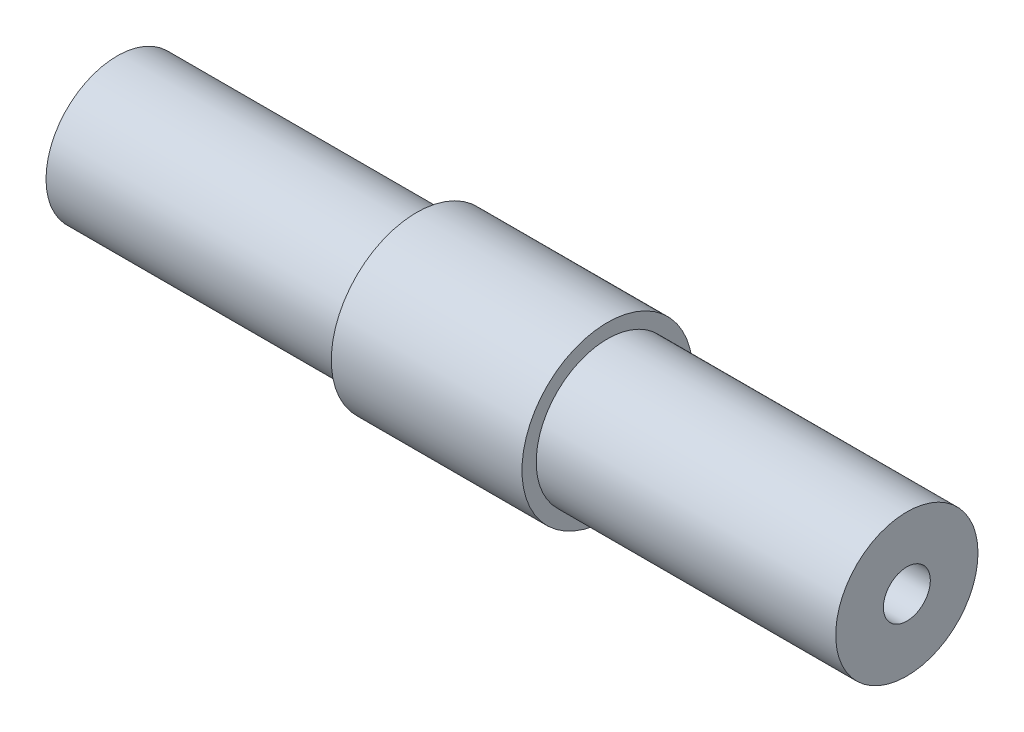
ISO-10303-21;
HEADER;
FILE_DESCRIPTION(('STEP AP214'),'2;1');
FILE_NAME('part.step','',(''),(''),'','','');
FILE_SCHEMA(('AUTOMOTIVE_DESIGN { 1 0 10303 214 1 1 1 1 }'));
ENDSEC;
DATA;
#1=APPLICATION_CONTEXT('core data for automotive mechanical design processes');
#2=APPLICATION_PROTOCOL_DEFINITION('international standard','automotive_design',2000,#1);
#3=PRODUCT_CONTEXT('',#1,'mechanical');
#4=PRODUCT('Part','Part','',(#3));
#5=PRODUCT_RELATED_PRODUCT_CATEGORY('part','',(#4));
#6=PRODUCT_DEFINITION_FORMATION('','',#4);
#7=PRODUCT_DEFINITION_CONTEXT('part definition',#1,'design');
#8=PRODUCT_DEFINITION('design','',#6,#7);
#9=PRODUCT_DEFINITION_SHAPE('','',#8);
#10=(LENGTH_UNIT() NAMED_UNIT(*) SI_UNIT(.MILLI.,.METRE.));
#11=(NAMED_UNIT(*) PLANE_ANGLE_UNIT() SI_UNIT($,.RADIAN.));
#12=(NAMED_UNIT(*) SI_UNIT($,.STERADIAN.) SOLID_ANGLE_UNIT());
#13=UNCERTAINTY_MEASURE_WITH_UNIT(LENGTH_MEASURE(1.E-05),#10,'distance_accuracy_value','');
#14=(GEOMETRIC_REPRESENTATION_CONTEXT(3) GLOBAL_UNCERTAINTY_ASSIGNED_CONTEXT((#13)) GLOBAL_UNIT_ASSIGNED_CONTEXT((#10,
#11,#12)) REPRESENTATION_CONTEXT('',''));
#15=CARTESIAN_POINT('',(0.,0.,0.));
#16=DIRECTION('',(0.,0.,1.));
#17=DIRECTION('',(1.,0.,0.));
#18=AXIS2_PLACEMENT_3D('',#15,#16,#17);
#19=CARTESIAN_POINT('',(13.4,0.,0.));
#20=DIRECTION('',(-1.,0.,0.));
#21=DIRECTION('',(0.,0.,1.));
#22=AXIS2_PLACEMENT_3D('',#19,#20,#21);
#23=CYLINDRICAL_SURFACE('',#22,6.);
#24=CARTESIAN_POINT('',(13.4,0.,0.));
#25=DIRECTION('',(1.,0.,0.));
#26=DIRECTION('',(0.,0.,-1.));
#27=AXIS2_PLACEMENT_3D('',#24,#25,#26);
#28=CIRCLE('',#27,6.);
#29=CARTESIAN_POINT('',(13.4,0.,-6.));
#30=VERTEX_POINT('',#29);
#31=EDGE_CURVE('E45',#30,#30,#28,.T.);
#32=ORIENTED_EDGE('',*,*,#31,.F.);
#33=EDGE_LOOP('',(#32));
#34=FACE_BOUND('',#33,.T.);
#35=CARTESIAN_POINT('',(0.,0.,0.));
#36=DIRECTION('',(1.,0.,0.));
#37=DIRECTION('',(0.,0.,-1.));
#38=AXIS2_PLACEMENT_3D('',#35,#36,#37);
#39=CIRCLE('',#38,6.);
#40=CARTESIAN_POINT('',(0.,0.,-6.));
#41=VERTEX_POINT('',#40);
#42=EDGE_CURVE('E36',#41,#41,#39,.T.);
#43=ORIENTED_EDGE('',*,*,#42,.T.);
#44=EDGE_LOOP('',(#43));
#45=FACE_BOUND('',#44,.T.);
#46=ADVANCED_FACE('F33',(#34,#45),#23,.T.);
#47=CARTESIAN_POINT('',(13.4,0.,0.));
#48=DIRECTION('',(1.,0.,0.));
#49=DIRECTION('',(0.,0.,-1.));
#50=AXIS2_PLACEMENT_3D('',#47,#48,#49);
#51=PLANE('',#50);
#52=CARTESIAN_POINT('',(13.4,0.,0.));
#53=DIRECTION('',(1.,0.,0.));
#54=DIRECTION('',(0.,0.,-1.));
#55=AXIS2_PLACEMENT_3D('',#52,#53,#54);
#56=CIRCLE('',#55,5.);
#57=CARTESIAN_POINT('',(13.4,0.,-5.));
#58=VERTEX_POINT('',#57);
#59=EDGE_CURVE('E40',#58,#58,#56,.T.);
#60=ORIENTED_EDGE('',*,*,#59,.F.);
#61=EDGE_LOOP('',(#60));
#62=FACE_BOUND('',#61,.T.);
#63=ORIENTED_EDGE('',*,*,#31,.T.);
#64=EDGE_LOOP('',(#63));
#65=FACE_BOUND('',#64,.T.);
#66=ADVANCED_FACE('F63',(#62,#65),#51,.T.);
#67=CARTESIAN_POINT('',(0.,0.,0.));
#68=DIRECTION('',(1.,0.,0.));
#69=DIRECTION('',(0.,0.,-1.));
#70=AXIS2_PLACEMENT_3D('',#67,#68,#69);
#71=PLANE('',#70);
#72=CARTESIAN_POINT('',(0.,0.,0.));
#73=DIRECTION('',(-1.,0.,0.));
#74=DIRECTION('',(0.,0.,1.));
#75=AXIS2_PLACEMENT_3D('',#72,#73,#74);
#76=CIRCLE('',#75,5.);
#77=CARTESIAN_POINT('',(0.,0.,5.));
#78=VERTEX_POINT('',#77);
#79=EDGE_CURVE('E10',#78,#78,#76,.T.);
#80=ORIENTED_EDGE('',*,*,#79,.F.);
#81=EDGE_LOOP('',(#80));
#82=FACE_BOUND('',#81,.T.);
#83=ORIENTED_EDGE('',*,*,#42,.F.);
#84=EDGE_LOOP('',(#83));
#85=FACE_BOUND('',#84,.T.);
#86=ADVANCED_FACE('F60',(#82,#85),#71,.F.);
#87=CARTESIAN_POINT('',(34.45,0.,0.));
#88=DIRECTION('',(-1.,0.,0.));
#89=DIRECTION('',(0.,0.,1.));
#90=AXIS2_PLACEMENT_3D('',#87,#88,#89);
#91=CYLINDRICAL_SURFACE('',#90,5.);
#92=CARTESIAN_POINT('',(34.45,0.,0.));
#93=DIRECTION('',(1.,0.,0.));
#94=DIRECTION('',(0.,0.,-1.));
#95=AXIS2_PLACEMENT_3D('',#92,#93,#94);
#96=CIRCLE('',#95,5.);
#97=CARTESIAN_POINT('',(34.45,0.,-5.));
#98=VERTEX_POINT('',#97);
#99=EDGE_CURVE('E51',#98,#98,#96,.T.);
#100=ORIENTED_EDGE('',*,*,#99,.F.);
#101=EDGE_LOOP('',(#100));
#102=FACE_BOUND('',#101,.T.);
#103=ORIENTED_EDGE('',*,*,#59,.T.);
#104=EDGE_LOOP('',(#103));
#105=FACE_BOUND('',#104,.T.);
#106=ADVANCED_FACE('F62',(#102,#105),#91,.T.);
#107=CARTESIAN_POINT('',(34.45,0.,0.));
#108=DIRECTION('',(1.,0.,0.));
#109=DIRECTION('',(0.,0.,-1.));
#110=AXIS2_PLACEMENT_3D('',#107,#108,#109);
#111=PLANE('',#110);
#112=CARTESIAN_POINT('',(34.45,0.,0.));
#113=DIRECTION('',(1.,0.,0.));
#114=DIRECTION('',(0.,0.,-1.));
#115=AXIS2_PLACEMENT_3D('',#112,#113,#114);
#116=CIRCLE('',#115,1.65);
#117=CARTESIAN_POINT('',(34.45,0.,-1.65));
#118=VERTEX_POINT('',#117);
#119=EDGE_CURVE('E168',#118,#118,#116,.T.);
#120=ORIENTED_EDGE('',*,*,#119,.F.);
#121=EDGE_LOOP('',(#120));
#122=FACE_BOUND('',#121,.T.);
#123=ORIENTED_EDGE('',*,*,#99,.T.);
#124=EDGE_LOOP('',(#123));
#125=FACE_BOUND('',#124,.T.);
#126=ADVANCED_FACE('F69',(#122,#125),#111,.T.);
#127=CARTESIAN_POINT('',(-21.05,0.,0.));
#128=DIRECTION('',(1.,0.,0.));
#129=DIRECTION('',(0.,0.,-1.));
#130=AXIS2_PLACEMENT_3D('',#127,#128,#129);
#131=CYLINDRICAL_SURFACE('',#130,5.);
#132=CARTESIAN_POINT('',(-21.05,0.,0.));
#133=DIRECTION('',(-1.,0.,0.));
#134=DIRECTION('',(0.,0.,1.));
#135=AXIS2_PLACEMENT_3D('',#132,#133,#134);
#136=CIRCLE('',#135,5.);
#137=CARTESIAN_POINT('',(-21.05,0.,5.));
#138=VERTEX_POINT('',#137);
#139=EDGE_CURVE('E49',#138,#138,#136,.T.);
#140=ORIENTED_EDGE('',*,*,#139,.F.);
#141=EDGE_LOOP('',(#140));
#142=FACE_BOUND('',#141,.T.);
#143=ORIENTED_EDGE('',*,*,#79,.T.);
#144=EDGE_LOOP('',(#143));
#145=FACE_BOUND('',#144,.T.);
#146=ADVANCED_FACE('F99',(#142,#145),#131,.T.);
#147=CARTESIAN_POINT('',(-21.05,0.,0.));
#148=DIRECTION('',(-1.,0.,0.));
#149=DIRECTION('',(0.,0.,1.));
#150=AXIS2_PLACEMENT_3D('',#147,#148,#149);
#151=PLANE('',#150);
#152=CARTESIAN_POINT('',(-21.05,0.,0.));
#153=DIRECTION('',(-1.,0.,0.));
#154=DIRECTION('',(0.,0.,1.));
#155=AXIS2_PLACEMENT_3D('',#152,#153,#154);
#156=CIRCLE('',#155,1.65);
#157=CARTESIAN_POINT('',(-21.05,0.,1.65));
#158=VERTEX_POINT('',#157);
#159=EDGE_CURVE('E169',#158,#158,#156,.T.);
#160=ORIENTED_EDGE('',*,*,#159,.F.);
#161=EDGE_LOOP('',(#160));
#162=FACE_BOUND('',#161,.T.);
#163=ORIENTED_EDGE('',*,*,#139,.T.);
#164=EDGE_LOOP('',(#163));
#165=FACE_BOUND('',#164,.T.);
#166=ADVANCED_FACE('F104',(#162,#165),#151,.T.);
#167=CARTESIAN_POINT('',(24.45,0.,0.));
#168=DIRECTION('',(1.,0.,0.));
#169=DIRECTION('',(0.,0.,-1.));
#170=AXIS2_PLACEMENT_3D('',#167,#168,#169);
#171=CYLINDRICAL_SURFACE('',#170,1.65);
#172=CARTESIAN_POINT('',(24.45,0.,0.));
#173=DIRECTION('',(1.,0.,0.));
#174=DIRECTION('',(0.,0.,-1.));
#175=AXIS2_PLACEMENT_3D('',#172,#173,#174);
#176=CIRCLE('',#175,1.65);
#177=CARTESIAN_POINT('',(24.45,0.,-1.65));
#178=VERTEX_POINT('',#177);
#179=EDGE_CURVE('E172',#178,#178,#176,.T.);
#180=ORIENTED_EDGE('',*,*,#179,.F.);
#181=EDGE_LOOP('',(#180));
#182=FACE_BOUND('',#181,.T.);
#183=ORIENTED_EDGE('',*,*,#119,.T.);
#184=EDGE_LOOP('',(#183));
#185=FACE_BOUND('',#184,.T.);
#186=ADVANCED_FACE('F119',(#182,#185),#171,.F.);
#187=CARTESIAN_POINT('',(24.45,0.,0.));
#188=DIRECTION('',(1.,0.,0.));
#189=DIRECTION('',(0.,0.,-1.));
#190=AXIS2_PLACEMENT_3D('',#187,#188,#189);
#191=PLANE('',#190);
#192=ORIENTED_EDGE('',*,*,#179,.T.);
#193=EDGE_LOOP('',(#192));
#194=FACE_BOUND('',#193,.T.);
#195=ADVANCED_FACE('F124',(#194),#191,.T.);
#196=CARTESIAN_POINT('',(-11.05,0.,0.));
#197=DIRECTION('',(-1.,0.,0.));
#198=DIRECTION('',(0.,0.,1.));
#199=AXIS2_PLACEMENT_3D('',#196,#197,#198);
#200=CYLINDRICAL_SURFACE('',#199,1.65);
#201=CARTESIAN_POINT('',(-11.05,0.,0.));
#202=DIRECTION('',(-1.,0.,0.));
#203=DIRECTION('',(0.,0.,1.));
#204=AXIS2_PLACEMENT_3D('',#201,#202,#203);
#205=CIRCLE('',#204,1.65);
#206=CARTESIAN_POINT('',(-11.05,0.,1.65));
#207=VERTEX_POINT('',#206);
#208=EDGE_CURVE('E167',#207,#207,#205,.T.);
#209=ORIENTED_EDGE('',*,*,#208,.F.);
#210=EDGE_LOOP('',(#209));
#211=FACE_BOUND('',#210,.T.);
#212=ORIENTED_EDGE('',*,*,#159,.T.);
#213=EDGE_LOOP('',(#212));
#214=FACE_BOUND('',#213,.T.);
#215=ADVANCED_FACE('F134',(#211,#214),#200,.F.);
#216=CARTESIAN_POINT('',(-11.05,0.,0.));
#217=DIRECTION('',(-1.,0.,0.));
#218=DIRECTION('',(0.,0.,1.));
#219=AXIS2_PLACEMENT_3D('',#216,#217,#218);
#220=PLANE('',#219);
#221=ORIENTED_EDGE('',*,*,#208,.T.);
#222=EDGE_LOOP('',(#221));
#223=FACE_BOUND('',#222,.T.);
#224=ADVANCED_FACE('F151',(#223),#220,.T.);
#225=CLOSED_SHELL('',(#46,#66,#86,#106,#126,#146,#166,#186,#195,#215,#224));
#226=MANIFOLD_SOLID_BREP('B2',#225);
#227=ADVANCED_BREP_SHAPE_REPRESENTATION('',(#18,#226),#14);
#228=SHAPE_DEFINITION_REPRESENTATION(#9,#227);
ENDSEC;
END-ISO-10303-21;
